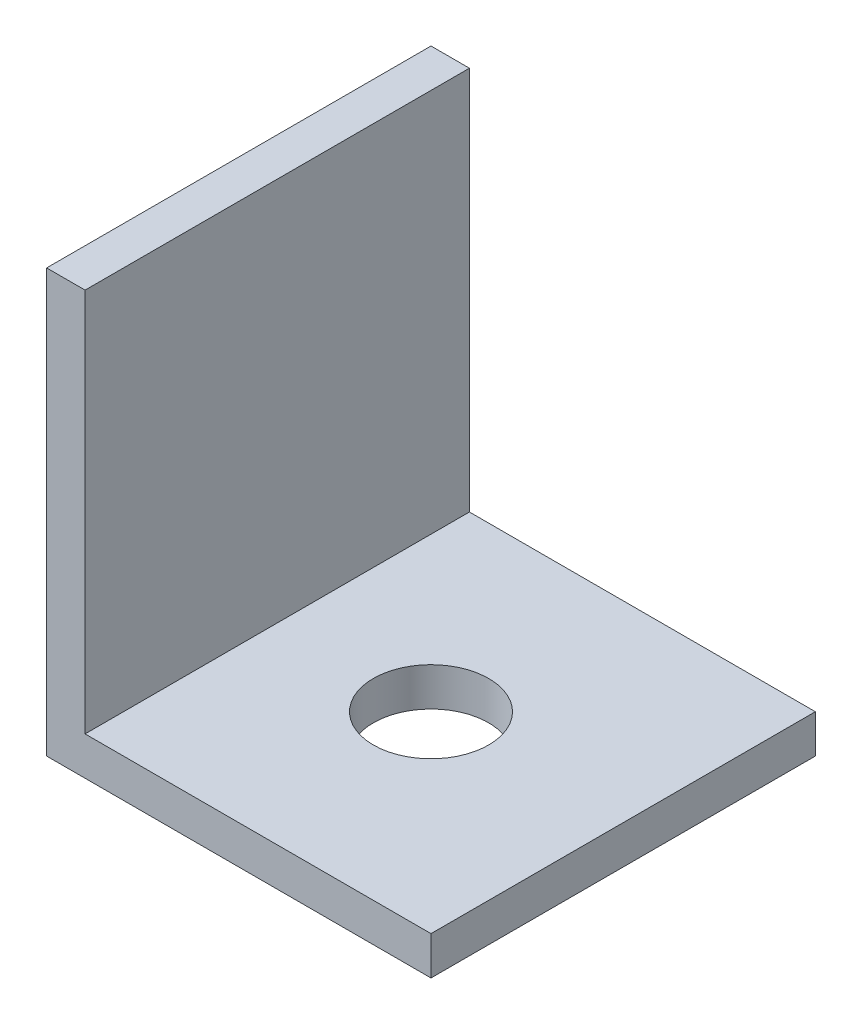
ISO-10303-21;
HEADER;
FILE_DESCRIPTION(('STEP AP214'),'2;1');
FILE_NAME('part.step','',(''),(''),'','','');
FILE_SCHEMA(('AUTOMOTIVE_DESIGN { 1 0 10303 214 1 1 1 1 }'));
ENDSEC;
DATA;
#1=APPLICATION_CONTEXT('core data for automotive mechanical design processes');
#2=APPLICATION_PROTOCOL_DEFINITION('international standard','automotive_design',2000,#1);
#3=PRODUCT_CONTEXT('',#1,'mechanical');
#4=PRODUCT('Part','Part','',(#3));
#5=PRODUCT_RELATED_PRODUCT_CATEGORY('part','',(#4));
#6=PRODUCT_DEFINITION_FORMATION('','',#4);
#7=PRODUCT_DEFINITION_CONTEXT('part definition',#1,'design');
#8=PRODUCT_DEFINITION('design','',#6,#7);
#9=PRODUCT_DEFINITION_SHAPE('','',#8);
#10=(LENGTH_UNIT() NAMED_UNIT(*) SI_UNIT(.MILLI.,.METRE.));
#11=(NAMED_UNIT(*) PLANE_ANGLE_UNIT() SI_UNIT($,.RADIAN.));
#12=(NAMED_UNIT(*) SI_UNIT($,.STERADIAN.) SOLID_ANGLE_UNIT());
#13=UNCERTAINTY_MEASURE_WITH_UNIT(LENGTH_MEASURE(1.E-05),#10,'distance_accuracy_value','');
#14=(GEOMETRIC_REPRESENTATION_CONTEXT(3) GLOBAL_UNCERTAINTY_ASSIGNED_CONTEXT((#13)) GLOBAL_UNIT_ASSIGNED_CONTEXT((#10,
#11,#12)) REPRESENTATION_CONTEXT('',''));
#15=CARTESIAN_POINT('',(0.,0.,0.));
#16=DIRECTION('',(0.,0.,1.));
#17=DIRECTION('',(1.,0.,0.));
#18=AXIS2_PLACEMENT_3D('',#15,#16,#17);
#19=CARTESIAN_POINT('',(0.,2.,0.));
#20=DIRECTION('',(0.,1.,0.));
#21=DIRECTION('',(0.,0.,1.));
#22=AXIS2_PLACEMENT_3D('',#19,#20,#21);
#23=PLANE('',#22);
#24=DIRECTION('',(0.,0.,-1.));
#25=VECTOR('',#24,1.);
#26=CARTESIAN_POINT('',(-8.,2.,-10.));
#27=LINE('',#26,#25);
#28=CARTESIAN_POINT('',(-8.,2.,10.));
#29=VERTEX_POINT('',#28);
#30=CARTESIAN_POINT('',(-8.,2.,-10.));
#31=VERTEX_POINT('',#30);
#32=EDGE_CURVE('E55',#29,#31,#27,.T.);
#33=ORIENTED_EDGE('',*,*,#32,.F.);
#34=DIRECTION('',(1.,0.,0.));
#35=VECTOR('',#34,1.);
#36=CARTESIAN_POINT('',(-10.,2.,10.));
#37=LINE('',#36,#35);
#38=CARTESIAN_POINT('',(10.,2.,10.));
#39=VERTEX_POINT('',#38);
#40=EDGE_CURVE('E60',#29,#39,#37,.T.);
#41=ORIENTED_EDGE('',*,*,#40,.T.);
#42=DIRECTION('',(0.,0.,-1.));
#43=VECTOR('',#42,1.);
#44=CARTESIAN_POINT('',(10.,2.,-10.));
#45=LINE('',#44,#43);
#46=CARTESIAN_POINT('',(10.,2.,-10.));
#47=VERTEX_POINT('',#46);
#48=EDGE_CURVE('E92',#39,#47,#45,.T.);
#49=ORIENTED_EDGE('',*,*,#48,.T.);
#50=DIRECTION('',(-1.,0.,0.));
#51=VECTOR('',#50,1.);
#52=CARTESIAN_POINT('',(-10.,2.,-10.));
#53=LINE('',#52,#51);
#54=EDGE_CURVE('E163',#47,#31,#53,.T.);
#55=ORIENTED_EDGE('',*,*,#54,.T.);
#56=EDGE_LOOP('',(#33,#41,#49,#55));
#57=FACE_BOUND('',#56,.T.);
#58=CARTESIAN_POINT('',(0.,2.,0.));
#59=DIRECTION('',(0.,1.,0.));
#60=DIRECTION('',(0.,0.,1.));
#61=AXIS2_PLACEMENT_3D('',#58,#59,#60);
#62=CIRCLE('',#61,3.);
#63=CARTESIAN_POINT('',(0.,2.,3.));
#64=VERTEX_POINT('',#63);
#65=EDGE_CURVE('E105',#64,#64,#62,.T.);
#66=ORIENTED_EDGE('',*,*,#65,.F.);
#67=EDGE_LOOP('',(#66));
#68=FACE_BOUND('',#67,.T.);
#69=ADVANCED_FACE('F39',(#57,#68),#23,.T.);
#70=CARTESIAN_POINT('',(0.,0.,0.));
#71=DIRECTION('',(0.,1.,0.));
#72=DIRECTION('',(0.,0.,1.));
#73=AXIS2_PLACEMENT_3D('',#70,#71,#72);
#74=PLANE('',#73);
#75=DIRECTION('',(0.,0.,-1.));
#76=VECTOR('',#75,1.);
#77=CARTESIAN_POINT('',(10.,0.,-10.));
#78=LINE('',#77,#76);
#79=CARTESIAN_POINT('',(10.,0.,10.));
#80=VERTEX_POINT('',#79);
#81=CARTESIAN_POINT('',(10.,0.,-10.));
#82=VERTEX_POINT('',#81);
#83=EDGE_CURVE('E98',#80,#82,#78,.T.);
#84=ORIENTED_EDGE('',*,*,#83,.F.);
#85=DIRECTION('',(1.,0.,0.));
#86=VECTOR('',#85,1.);
#87=CARTESIAN_POINT('',(-10.,0.,10.));
#88=LINE('',#87,#86);
#89=CARTESIAN_POINT('',(-10.,0.,10.));
#90=VERTEX_POINT('',#89);
#91=EDGE_CURVE('E80',#90,#80,#88,.T.);
#92=ORIENTED_EDGE('',*,*,#91,.F.);
#93=DIRECTION('',(0.,0.,1.));
#94=VECTOR('',#93,1.);
#95=CARTESIAN_POINT('',(-10.,0.,-10.));
#96=LINE('',#95,#94);
#97=CARTESIAN_POINT('',(-10.,0.,-10.));
#98=VERTEX_POINT('',#97);
#99=EDGE_CURVE('E93',#98,#90,#96,.T.);
#100=ORIENTED_EDGE('',*,*,#99,.F.);
#101=DIRECTION('',(-1.,0.,0.));
#102=VECTOR('',#101,1.);
#103=CARTESIAN_POINT('',(-10.,0.,-10.));
#104=LINE('',#103,#102);
#105=EDGE_CURVE('E103',#82,#98,#104,.T.);
#106=ORIENTED_EDGE('',*,*,#105,.F.);
#107=EDGE_LOOP('',(#84,#92,#100,#106));
#108=FACE_BOUND('',#107,.T.);
#109=CARTESIAN_POINT('',(0.,0.,0.));
#110=DIRECTION('',(0.,1.,0.));
#111=DIRECTION('',(0.,0.,1.));
#112=AXIS2_PLACEMENT_3D('',#109,#110,#111);
#113=CIRCLE('',#112,3.);
#114=CARTESIAN_POINT('',(0.,0.,3.));
#115=VERTEX_POINT('',#114);
#116=EDGE_CURVE('E111',#115,#115,#113,.T.);
#117=ORIENTED_EDGE('',*,*,#116,.T.);
#118=EDGE_LOOP('',(#117));
#119=FACE_BOUND('',#118,.T.);
#120=ADVANCED_FACE('F101',(#108,#119),#74,.F.);
#121=CARTESIAN_POINT('',(10.,2.,-10.));
#122=DIRECTION('',(-1.,0.,0.));
#123=DIRECTION('',(0.,0.,1.));
#124=AXIS2_PLACEMENT_3D('',#121,#122,#123);
#125=PLANE('',#124);
#126=ORIENTED_EDGE('',*,*,#83,.T.);
#127=DIRECTION('',(0.,-1.,0.));
#128=VECTOR('',#127,1.);
#129=CARTESIAN_POINT('',(10.,2.,-10.));
#130=LINE('',#129,#128);
#131=EDGE_CURVE('E11',#47,#82,#130,.T.);
#132=ORIENTED_EDGE('',*,*,#131,.F.);
#133=ORIENTED_EDGE('',*,*,#48,.F.);
#134=DIRECTION('',(0.,-1.,0.));
#135=VECTOR('',#134,1.);
#136=CARTESIAN_POINT('',(10.,2.,10.));
#137=LINE('',#136,#135);
#138=EDGE_CURVE('E83',#39,#80,#137,.T.);
#139=ORIENTED_EDGE('',*,*,#138,.T.);
#140=EDGE_LOOP('',(#126,#132,#133,#139));
#141=FACE_BOUND('',#140,.T.);
#142=ADVANCED_FACE('F41',(#141),#125,.F.);
#143=CARTESIAN_POINT('',(-10.,2.,-10.));
#144=DIRECTION('',(0.,0.,1.));
#145=DIRECTION('',(1.,0.,0.));
#146=AXIS2_PLACEMENT_3D('',#143,#144,#145);
#147=PLANE('',#146);
#148=ORIENTED_EDGE('',*,*,#105,.T.);
#149=DIRECTION('',(0.,-1.,0.));
#150=VECTOR('',#149,1.);
#151=CARTESIAN_POINT('',(-10.,2.,-10.));
#152=LINE('',#151,#150);
#153=CARTESIAN_POINT('',(-10.,22.,-10.));
#154=VERTEX_POINT('',#153);
#155=EDGE_CURVE('E48',#154,#98,#152,.T.);
#156=ORIENTED_EDGE('',*,*,#155,.F.);
#157=DIRECTION('',(-1.,0.,0.));
#158=VECTOR('',#157,1.);
#159=CARTESIAN_POINT('',(-10.,22.,-10.));
#160=LINE('',#159,#158);
#161=CARTESIAN_POINT('',(-8.,22.,-10.));
#162=VERTEX_POINT('',#161);
#163=EDGE_CURVE('E133',#162,#154,#160,.T.);
#164=ORIENTED_EDGE('',*,*,#163,.F.);
#165=DIRECTION('',(0.,-1.,0.));
#166=VECTOR('',#165,1.);
#167=CARTESIAN_POINT('',(-8.,22.,-10.));
#168=LINE('',#167,#166);
#169=EDGE_CURVE('E144',#162,#31,#168,.T.);
#170=ORIENTED_EDGE('',*,*,#169,.T.);
#171=ORIENTED_EDGE('',*,*,#54,.F.);
#172=ORIENTED_EDGE('',*,*,#131,.T.);
#173=EDGE_LOOP('',(#148,#156,#164,#170,#171,#172));
#174=FACE_BOUND('',#173,.T.);
#175=ADVANCED_FACE('F130',(#174),#147,.F.);
#176=CARTESIAN_POINT('',(-10.,2.,-10.));
#177=DIRECTION('',(1.,0.,0.));
#178=DIRECTION('',(0.,0.,-1.));
#179=AXIS2_PLACEMENT_3D('',#176,#177,#178);
#180=PLANE('',#179);
#181=ORIENTED_EDGE('',*,*,#99,.T.);
#182=DIRECTION('',(0.,-1.,0.));
#183=VECTOR('',#182,1.);
#184=CARTESIAN_POINT('',(-10.,2.,10.));
#185=LINE('',#184,#183);
#186=CARTESIAN_POINT('',(-10.,22.,10.));
#187=VERTEX_POINT('',#186);
#188=EDGE_CURVE('E87',#187,#90,#185,.T.);
#189=ORIENTED_EDGE('',*,*,#188,.F.);
#190=DIRECTION('',(0.,0.,1.));
#191=VECTOR('',#190,1.);
#192=CARTESIAN_POINT('',(-10.,22.,-10.));
#193=LINE('',#192,#191);
#194=EDGE_CURVE('E126',#154,#187,#193,.T.);
#195=ORIENTED_EDGE('',*,*,#194,.F.);
#196=ORIENTED_EDGE('',*,*,#155,.T.);
#197=EDGE_LOOP('',(#181,#189,#195,#196));
#198=FACE_BOUND('',#197,.T.);
#199=ADVANCED_FACE('F124',(#198),#180,.F.);
#200=CARTESIAN_POINT('',(-10.,2.,10.));
#201=DIRECTION('',(0.,0.,-1.));
#202=DIRECTION('',(-1.,0.,0.));
#203=AXIS2_PLACEMENT_3D('',#200,#201,#202);
#204=PLANE('',#203);
#205=ORIENTED_EDGE('',*,*,#91,.T.);
#206=ORIENTED_EDGE('',*,*,#138,.F.);
#207=ORIENTED_EDGE('',*,*,#40,.F.);
#208=DIRECTION('',(0.,-1.,0.));
#209=VECTOR('',#208,1.);
#210=CARTESIAN_POINT('',(-8.,22.,10.));
#211=LINE('',#210,#209);
#212=CARTESIAN_POINT('',(-8.,22.,10.));
#213=VERTEX_POINT('',#212);
#214=EDGE_CURVE('E148',#213,#29,#211,.T.);
#215=ORIENTED_EDGE('',*,*,#214,.F.);
#216=DIRECTION('',(1.,0.,0.));
#217=VECTOR('',#216,1.);
#218=CARTESIAN_POINT('',(-10.,22.,10.));
#219=LINE('',#218,#217);
#220=EDGE_CURVE('E150',#187,#213,#219,.T.);
#221=ORIENTED_EDGE('',*,*,#220,.F.);
#222=ORIENTED_EDGE('',*,*,#188,.T.);
#223=EDGE_LOOP('',(#205,#206,#207,#215,#221,#222));
#224=FACE_BOUND('',#223,.T.);
#225=ADVANCED_FACE('F82',(#224),#204,.F.);
#226=CARTESIAN_POINT('',(0.,2.,0.));
#227=DIRECTION('',(0.,-1.,0.));
#228=DIRECTION('',(0.,0.,-1.));
#229=AXIS2_PLACEMENT_3D('',#226,#227,#228);
#230=CYLINDRICAL_SURFACE('',#229,3.);
#231=ORIENTED_EDGE('',*,*,#65,.T.);
#232=EDGE_LOOP('',(#231));
#233=FACE_BOUND('',#232,.T.);
#234=ORIENTED_EDGE('',*,*,#116,.F.);
#235=EDGE_LOOP('',(#234));
#236=FACE_BOUND('',#235,.T.);
#237=ADVANCED_FACE('F179',(#233,#236),#230,.F.);
#238=CARTESIAN_POINT('',(-8.,22.,-10.));
#239=DIRECTION('',(-1.,0.,0.));
#240=DIRECTION('',(0.,0.,1.));
#241=AXIS2_PLACEMENT_3D('',#238,#239,#240);
#242=PLANE('',#241);
#243=ORIENTED_EDGE('',*,*,#32,.T.);
#244=ORIENTED_EDGE('',*,*,#169,.F.);
#245=DIRECTION('',(0.,0.,-1.));
#246=VECTOR('',#245,1.);
#247=CARTESIAN_POINT('',(-8.,22.,-10.));
#248=LINE('',#247,#246);
#249=EDGE_CURVE('E141',#213,#162,#248,.T.);
#250=ORIENTED_EDGE('',*,*,#249,.F.);
#251=ORIENTED_EDGE('',*,*,#214,.T.);
#252=EDGE_LOOP('',(#243,#244,#250,#251));
#253=FACE_BOUND('',#252,.T.);
#254=ADVANCED_FACE('F169',(#253),#242,.F.);
#255=CARTESIAN_POINT('',(0.,22.,0.));
#256=DIRECTION('',(0.,1.,0.));
#257=DIRECTION('',(0.,0.,1.));
#258=AXIS2_PLACEMENT_3D('',#255,#256,#257);
#259=PLANE('',#258);
#260=ORIENTED_EDGE('',*,*,#194,.T.);
#261=ORIENTED_EDGE('',*,*,#220,.T.);
#262=ORIENTED_EDGE('',*,*,#249,.T.);
#263=ORIENTED_EDGE('',*,*,#163,.T.);
#264=EDGE_LOOP('',(#260,#261,#262,#263));
#265=FACE_BOUND('',#264,.T.);
#266=ADVANCED_FACE('F137',(#265),#259,.T.);
#267=CLOSED_SHELL('',(#69,#120,#142,#175,#199,#225,#237,#254,#266));
#268=MANIFOLD_SOLID_BREP('B2',#267);
#269=ADVANCED_BREP_SHAPE_REPRESENTATION('',(#18,#268),#14);
#270=SHAPE_DEFINITION_REPRESENTATION(#9,#269);
ENDSEC;
END-ISO-10303-21;
